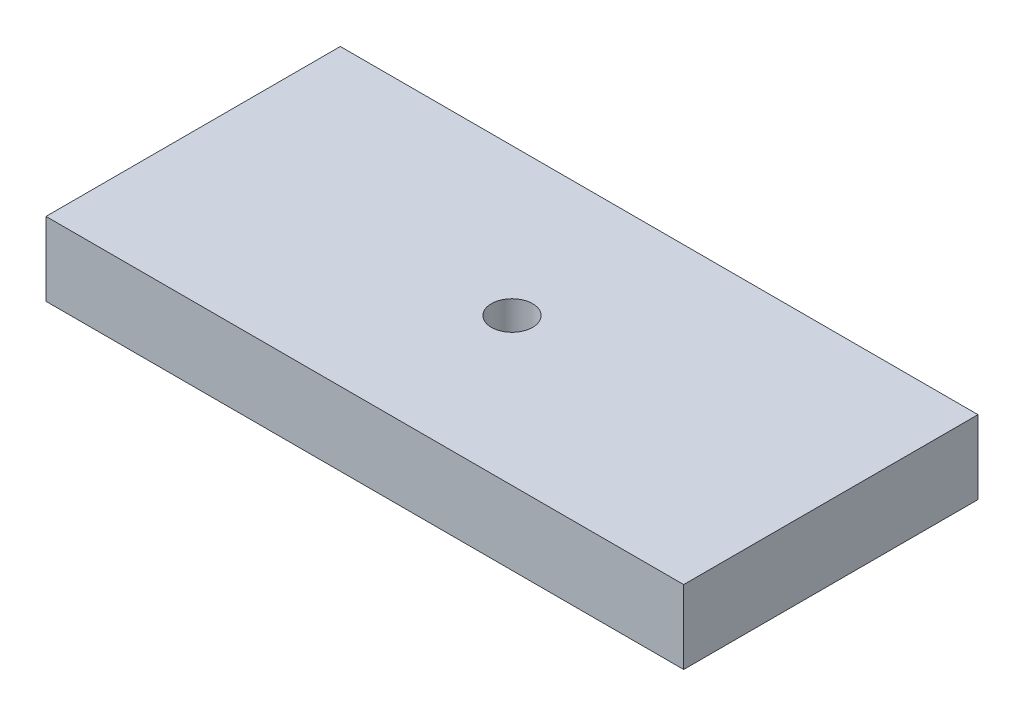
ISO-10303-21;
HEADER;
FILE_DESCRIPTION(('STEP AP214'),'2;1');
FILE_NAME('part.step','',(''),(''),'','','');
FILE_SCHEMA(('AUTOMOTIVE_DESIGN { 1 0 10303 214 1 1 1 1 }'));
ENDSEC;
DATA;
#1=APPLICATION_CONTEXT('core data for automotive mechanical design processes');
#2=APPLICATION_PROTOCOL_DEFINITION('international standard','automotive_design',2000,#1);
#3=PRODUCT_CONTEXT('',#1,'mechanical');
#4=PRODUCT('Part','Part','',(#3));
#5=PRODUCT_RELATED_PRODUCT_CATEGORY('part','',(#4));
#6=PRODUCT_DEFINITION_FORMATION('','',#4);
#7=PRODUCT_DEFINITION_CONTEXT('part definition',#1,'design');
#8=PRODUCT_DEFINITION('design','',#6,#7);
#9=PRODUCT_DEFINITION_SHAPE('','',#8);
#10=(LENGTH_UNIT() NAMED_UNIT(*) SI_UNIT(.MILLI.,.METRE.));
#11=(NAMED_UNIT(*) PLANE_ANGLE_UNIT() SI_UNIT($,.RADIAN.));
#12=(NAMED_UNIT(*) SI_UNIT($,.STERADIAN.) SOLID_ANGLE_UNIT());
#13=UNCERTAINTY_MEASURE_WITH_UNIT(LENGTH_MEASURE(1.E-05),#10,'distance_accuracy_value','');
#14=(GEOMETRIC_REPRESENTATION_CONTEXT(3) GLOBAL_UNCERTAINTY_ASSIGNED_CONTEXT((#13)) GLOBAL_UNIT_ASSIGNED_CONTEXT((#10,
#11,#12)) REPRESENTATION_CONTEXT('',''));
#15=CARTESIAN_POINT('',(0.,0.,0.));
#16=DIRECTION('',(0.,0.,1.));
#17=DIRECTION('',(1.,0.,0.));
#18=AXIS2_PLACEMENT_3D('',#15,#16,#17);
#19=CARTESIAN_POINT('',(65.,15.,30.));
#20=DIRECTION('',(-1.,0.,0.));
#21=DIRECTION('',(0.,0.,1.));
#22=AXIS2_PLACEMENT_3D('',#19,#20,#21);
#23=PLANE('',#22);
#24=DIRECTION('',(0.,0.,-1.));
#25=VECTOR('',#24,1.);
#26=CARTESIAN_POINT('',(65.,0.,30.));
#27=LINE('',#26,#25);
#28=CARTESIAN_POINT('',(65.,0.,30.));
#29=VERTEX_POINT('',#28);
#30=CARTESIAN_POINT('',(65.,0.,-30.));
#31=VERTEX_POINT('',#30);
#32=EDGE_CURVE('E96',#29,#31,#27,.T.);
#33=ORIENTED_EDGE('',*,*,#32,.T.);
#34=DIRECTION('',(0.,-1.,0.));
#35=VECTOR('',#34,1.);
#36=CARTESIAN_POINT('',(65.,15.,-30.));
#37=LINE('',#36,#35);
#38=CARTESIAN_POINT('',(65.,15.,-30.));
#39=VERTEX_POINT('',#38);
#40=EDGE_CURVE('E11',#39,#31,#37,.T.);
#41=ORIENTED_EDGE('',*,*,#40,.F.);
#42=DIRECTION('',(0.,0.,-1.));
#43=VECTOR('',#42,1.);
#44=CARTESIAN_POINT('',(65.,15.,30.));
#45=LINE('',#44,#43);
#46=CARTESIAN_POINT('',(65.,15.,30.));
#47=VERTEX_POINT('',#46);
#48=EDGE_CURVE('E84',#47,#39,#45,.T.);
#49=ORIENTED_EDGE('',*,*,#48,.F.);
#50=DIRECTION('',(0.,-1.,0.));
#51=VECTOR('',#50,1.);
#52=CARTESIAN_POINT('',(65.,15.,30.));
#53=LINE('',#52,#51);
#54=EDGE_CURVE('E92',#47,#29,#53,.T.);
#55=ORIENTED_EDGE('',*,*,#54,.T.);
#56=EDGE_LOOP('',(#33,#41,#49,#55));
#57=FACE_BOUND('',#56,.T.);
#58=ADVANCED_FACE('F33',(#57),#23,.F.);
#59=CARTESIAN_POINT('',(-65.,15.,-30.));
#60=DIRECTION('',(0.,0.,1.));
#61=DIRECTION('',(1.,0.,0.));
#62=AXIS2_PLACEMENT_3D('',#59,#60,#61);
#63=PLANE('',#62);
#64=DIRECTION('',(-1.,0.,0.));
#65=VECTOR('',#64,1.);
#66=CARTESIAN_POINT('',(-65.,0.,-30.));
#67=LINE('',#66,#65);
#68=CARTESIAN_POINT('',(-65.,0.,-30.));
#69=VERTEX_POINT('',#68);
#70=EDGE_CURVE('E88',#31,#69,#67,.T.);
#71=ORIENTED_EDGE('',*,*,#70,.T.);
#72=DIRECTION('',(0.,-1.,0.));
#73=VECTOR('',#72,1.);
#74=CARTESIAN_POINT('',(-65.,15.,-30.));
#75=LINE('',#74,#73);
#76=CARTESIAN_POINT('',(-65.,15.,-30.));
#77=VERTEX_POINT('',#76);
#78=EDGE_CURVE('E41',#77,#69,#75,.T.);
#79=ORIENTED_EDGE('',*,*,#78,.F.);
#80=DIRECTION('',(-1.,0.,0.));
#81=VECTOR('',#80,1.);
#82=CARTESIAN_POINT('',(-65.,15.,-30.));
#83=LINE('',#82,#81);
#84=EDGE_CURVE('E79',#39,#77,#83,.T.);
#85=ORIENTED_EDGE('',*,*,#84,.F.);
#86=ORIENTED_EDGE('',*,*,#40,.T.);
#87=EDGE_LOOP('',(#71,#79,#85,#86));
#88=FACE_BOUND('',#87,.T.);
#89=ADVANCED_FACE('F87',(#88),#63,.F.);
#90=CARTESIAN_POINT('',(-65.,15.,30.));
#91=DIRECTION('',(1.,0.,0.));
#92=DIRECTION('',(0.,0.,-1.));
#93=AXIS2_PLACEMENT_3D('',#90,#91,#92);
#94=PLANE('',#93);
#95=DIRECTION('',(0.,0.,1.));
#96=VECTOR('',#95,1.);
#97=CARTESIAN_POINT('',(-65.,0.,30.));
#98=LINE('',#97,#96);
#99=CARTESIAN_POINT('',(-65.,0.,30.));
#100=VERTEX_POINT('',#99);
#101=EDGE_CURVE('E66',#69,#100,#98,.T.);
#102=ORIENTED_EDGE('',*,*,#101,.T.);
#103=DIRECTION('',(0.,-1.,0.));
#104=VECTOR('',#103,1.);
#105=CARTESIAN_POINT('',(-65.,15.,30.));
#106=LINE('',#105,#104);
#107=CARTESIAN_POINT('',(-65.,15.,30.));
#108=VERTEX_POINT('',#107);
#109=EDGE_CURVE('E89',#108,#100,#106,.T.);
#110=ORIENTED_EDGE('',*,*,#109,.F.);
#111=DIRECTION('',(0.,0.,1.));
#112=VECTOR('',#111,1.);
#113=CARTESIAN_POINT('',(-65.,15.,30.));
#114=LINE('',#113,#112);
#115=EDGE_CURVE('E82',#77,#108,#114,.T.);
#116=ORIENTED_EDGE('',*,*,#115,.F.);
#117=ORIENTED_EDGE('',*,*,#78,.T.);
#118=EDGE_LOOP('',(#102,#110,#116,#117));
#119=FACE_BOUND('',#118,.T.);
#120=ADVANCED_FACE('F90',(#119),#94,.F.);
#121=CARTESIAN_POINT('',(-65.,15.,30.));
#122=DIRECTION('',(0.,0.,-1.));
#123=DIRECTION('',(-1.,0.,0.));
#124=AXIS2_PLACEMENT_3D('',#121,#122,#123);
#125=PLANE('',#124);
#126=DIRECTION('',(1.,0.,0.));
#127=VECTOR('',#126,1.);
#128=CARTESIAN_POINT('',(-65.,0.,30.));
#129=LINE('',#128,#127);
#130=EDGE_CURVE('E72',#100,#29,#129,.T.);
#131=ORIENTED_EDGE('',*,*,#130,.T.);
#132=ORIENTED_EDGE('',*,*,#54,.F.);
#133=DIRECTION('',(1.,0.,0.));
#134=VECTOR('',#133,1.);
#135=CARTESIAN_POINT('',(-65.,15.,30.));
#136=LINE('',#135,#134);
#137=EDGE_CURVE('E49',#108,#47,#136,.T.);
#138=ORIENTED_EDGE('',*,*,#137,.F.);
#139=ORIENTED_EDGE('',*,*,#109,.T.);
#140=EDGE_LOOP('',(#131,#132,#138,#139));
#141=FACE_BOUND('',#140,.T.);
#142=ADVANCED_FACE('F104',(#141),#125,.F.);
#143=CARTESIAN_POINT('',(0.,15.,0.));
#144=DIRECTION('',(0.,-1.,0.));
#145=DIRECTION('',(0.,0.,-1.));
#146=AXIS2_PLACEMENT_3D('',#143,#144,#145);
#147=PLANE('',#146);
#148=CARTESIAN_POINT('',(0.,15.,0.));
#149=DIRECTION('',(0.,1.,0.));
#150=DIRECTION('',(0.,0.,1.));
#151=AXIS2_PLACEMENT_3D('',#148,#149,#150);
#152=CIRCLE('',#151,4.19555758438758);
#153=CARTESIAN_POINT('',(0.,15.,4.19555758438758));
#154=VERTEX_POINT('',#153);
#155=EDGE_CURVE('E110',#154,#154,#152,.T.);
#156=ORIENTED_EDGE('',*,*,#155,.F.);
#157=EDGE_LOOP('',(#156));
#158=FACE_BOUND('',#157,.T.);
#159=ORIENTED_EDGE('',*,*,#48,.T.);
#160=ORIENTED_EDGE('',*,*,#84,.T.);
#161=ORIENTED_EDGE('',*,*,#115,.T.);
#162=ORIENTED_EDGE('',*,*,#137,.T.);
#163=EDGE_LOOP('',(#159,#160,#161,#162));
#164=FACE_BOUND('',#163,.T.);
#165=ADVANCED_FACE('F80',(#158,#164),#147,.F.);
#166=CARTESIAN_POINT('',(0.,0.,0.));
#167=DIRECTION('',(0.,-1.,0.));
#168=DIRECTION('',(0.,0.,-1.));
#169=AXIS2_PLACEMENT_3D('',#166,#167,#168);
#170=PLANE('',#169);
#171=CARTESIAN_POINT('',(0.,0.,0.));
#172=DIRECTION('',(0.,1.,0.));
#173=DIRECTION('',(0.,0.,1.));
#174=AXIS2_PLACEMENT_3D('',#171,#172,#173);
#175=CIRCLE('',#174,4.19555758438758);
#176=CARTESIAN_POINT('',(0.,0.,4.19555758438758));
#177=VERTEX_POINT('',#176);
#178=EDGE_CURVE('E99',#177,#177,#175,.T.);
#179=ORIENTED_EDGE('',*,*,#178,.T.);
#180=EDGE_LOOP('',(#179));
#181=FACE_BOUND('',#180,.T.);
#182=ORIENTED_EDGE('',*,*,#32,.F.);
#183=ORIENTED_EDGE('',*,*,#130,.F.);
#184=ORIENTED_EDGE('',*,*,#101,.F.);
#185=ORIENTED_EDGE('',*,*,#70,.F.);
#186=EDGE_LOOP('',(#182,#183,#184,#185));
#187=FACE_BOUND('',#186,.T.);
#188=ADVANCED_FACE('F107',(#181,#187),#170,.T.);
#189=CARTESIAN_POINT('',(0.,0.,0.));
#190=DIRECTION('',(0.,1.,0.));
#191=DIRECTION('',(0.,0.,1.));
#192=AXIS2_PLACEMENT_3D('',#189,#190,#191);
#193=CYLINDRICAL_SURFACE('',#192,4.19555758438758);
#194=ORIENTED_EDGE('',*,*,#178,.F.);
#195=EDGE_LOOP('',(#194));
#196=FACE_BOUND('',#195,.T.);
#197=ORIENTED_EDGE('',*,*,#155,.T.);
#198=EDGE_LOOP('',(#197));
#199=FACE_BOUND('',#198,.T.);
#200=ADVANCED_FACE('F117',(#196,#199),#193,.F.);
#201=CLOSED_SHELL('',(#58,#89,#120,#142,#165,#188,#200));
#202=MANIFOLD_SOLID_BREP('B2',#201);
#203=ADVANCED_BREP_SHAPE_REPRESENTATION('',(#18,#202),#14);
#204=SHAPE_DEFINITION_REPRESENTATION(#9,#203);
ENDSEC;
END-ISO-10303-21;
